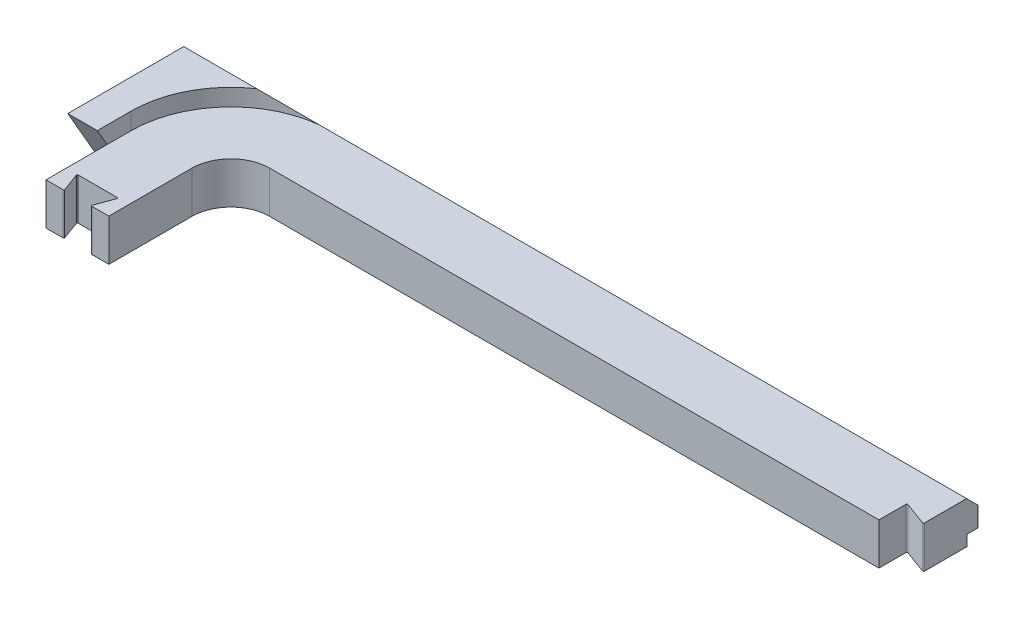
ISO-10303-21;
HEADER;
FILE_DESCRIPTION(('STEP AP214'),'2;1');
FILE_NAME('part.step','',(''),(''),'','','');
FILE_SCHEMA(('AUTOMOTIVE_DESIGN { 1 0 10303 214 1 1 1 1 }'));
ENDSEC;
DATA;
#1=APPLICATION_CONTEXT('core data for automotive mechanical design processes');
#2=APPLICATION_PROTOCOL_DEFINITION('international standard','automotive_design',2000,#1);
#3=PRODUCT_CONTEXT('',#1,'mechanical');
#4=PRODUCT('Part','Part','',(#3));
#5=PRODUCT_RELATED_PRODUCT_CATEGORY('part','',(#4));
#6=PRODUCT_DEFINITION_FORMATION('','',#4);
#7=PRODUCT_DEFINITION_CONTEXT('part definition',#1,'design');
#8=PRODUCT_DEFINITION('design','',#6,#7);
#9=PRODUCT_DEFINITION_SHAPE('','',#8);
#10=(LENGTH_UNIT() NAMED_UNIT(*) SI_UNIT(.MILLI.,.METRE.));
#11=(NAMED_UNIT(*) PLANE_ANGLE_UNIT() SI_UNIT($,.RADIAN.));
#12=(NAMED_UNIT(*) SI_UNIT($,.STERADIAN.) SOLID_ANGLE_UNIT());
#13=UNCERTAINTY_MEASURE_WITH_UNIT(LENGTH_MEASURE(1.E-05),#10,'distance_accuracy_value','');
#14=(GEOMETRIC_REPRESENTATION_CONTEXT(3) GLOBAL_UNCERTAINTY_ASSIGNED_CONTEXT((#13)) GLOBAL_UNIT_ASSIGNED_CONTEXT((#10,
#11,#12)) REPRESENTATION_CONTEXT('',''));
#15=CARTESIAN_POINT('',(0.,0.,0.));
#16=DIRECTION('',(0.,0.,1.));
#17=DIRECTION('',(1.,0.,0.));
#18=AXIS2_PLACEMENT_3D('',#15,#16,#17);
#19=CARTESIAN_POINT('',(-192.3375,0.,0.));
#20=DIRECTION('',(-1.,0.,0.));
#21=DIRECTION('',(0.,0.,1.));
#22=AXIS2_PLACEMENT_3D('',#19,#20,#21);
#23=PLANE('',#22);
#24=DIRECTION('',(0.,-0.707106781186551,-0.707106781186544));
#25=VECTOR('',#24,1.);
#26=CARTESIAN_POINT('',(-192.3375,-2.49586231119696,-370.926089279623));
#27=LINE('',#26,#25);
#28=CARTESIAN_POINT('',(-192.3375,10.2419838828646,-358.188243085561));
#29=VERTEX_POINT('',#28);
#30=CARTESIAN_POINT('',(-192.3375,2.9,-365.530226968426));
#31=VERTEX_POINT('',#30);
#32=EDGE_CURVE('E342',#29,#31,#27,.T.);
#33=ORIENTED_EDGE('',*,*,#32,.F.);
#34=DIRECTION('',(0.,1.,0.));
#35=VECTOR('',#34,1.);
#36=CARTESIAN_POINT('',(-192.3375,0.,-358.188243085561));
#37=LINE('',#36,#35);
#38=CARTESIAN_POINT('',(-192.3375,2.9,-358.188243085561));
#39=VERTEX_POINT('',#38);
#40=EDGE_CURVE('E477',#29,#39,#37,.F.);
#41=ORIENTED_EDGE('',*,*,#40,.T.);
#42=DIRECTION('',(0.,0.,1.));
#43=VECTOR('',#42,1.);
#44=CARTESIAN_POINT('',(-192.3375,2.9,0.));
#45=LINE('',#44,#43);
#46=EDGE_CURVE('E338',#31,#39,#45,.T.);
#47=ORIENTED_EDGE('',*,*,#46,.F.);
#48=EDGE_LOOP('',(#33,#41,#47));
#49=FACE_BOUND('',#48,.T.);
#50=ADVANCED_FACE('F47',(#49),#23,.F.);
#51=CARTESIAN_POINT('',(0.,0.,-307.275));
#52=DIRECTION('',(0.,0.,-1.));
#53=DIRECTION('',(-1.,0.,0.));
#54=AXIS2_PLACEMENT_3D('',#51,#52,#53);
#55=PLANE('',#54);
#56=DIRECTION('',(-1.,0.,0.));
#57=VECTOR('',#56,1.);
#58=CARTESIAN_POINT('',(-357.675,0.,-307.275));
#59=LINE('',#58,#57);
#60=CARTESIAN_POINT('',(-380.060629601348,0.,-307.275));
#61=VERTEX_POINT('',#60);
#62=CARTESIAN_POINT('',(-384.675,0.,-307.275));
#63=VERTEX_POINT('',#62);
#64=EDGE_CURVE('E333',#61,#63,#59,.T.);
#65=ORIENTED_EDGE('',*,*,#64,.F.);
#66=DIRECTION('',(0.,1.,0.));
#67=VECTOR('',#66,1.);
#68=CARTESIAN_POINT('',(-380.060629601348,0.,-307.275));
#69=LINE('',#68,#67);
#70=CARTESIAN_POINT('',(-380.060629601348,11.31,-307.275));
#71=VERTEX_POINT('',#70);
#72=EDGE_CURVE('E536',#61,#71,#69,.T.);
#73=ORIENTED_EDGE('',*,*,#72,.T.);
#74=DIRECTION('',(-1.,0.,0.));
#75=VECTOR('',#74,1.);
#76=CARTESIAN_POINT('',(-357.675,11.31,-307.275));
#77=LINE('',#76,#75);
#78=CARTESIAN_POINT('',(-384.675,11.31,-307.275));
#79=VERTEX_POINT('',#78);
#80=EDGE_CURVE('E468',#71,#79,#77,.T.);
#81=ORIENTED_EDGE('',*,*,#80,.T.);
#82=DIRECTION('',(0.,1.,0.));
#83=VECTOR('',#82,1.);
#84=CARTESIAN_POINT('',(-384.675,2.9,-307.275));
#85=LINE('',#84,#83);
#86=EDGE_CURVE('E334',#63,#79,#85,.T.);
#87=ORIENTED_EDGE('',*,*,#86,.F.);
#88=EDGE_LOOP('',(#65,#73,#81,#87));
#89=FACE_BOUND('',#88,.T.);
#90=ADVANCED_FACE('F583',(#89),#55,.F.);
#91=CARTESIAN_POINT('',(-367.675,11.31,-307.275));
#92=VERTEX_POINT('',#91);
#93=CARTESIAN_POINT('',(-372.289370398652,11.31,-307.275));
#94=VERTEX_POINT('',#93);
#95=EDGE_CURVE('E464',#92,#94,#77,.T.);
#96=ORIENTED_EDGE('',*,*,#95,.T.);
#97=DIRECTION('',(0.,1.,0.));
#98=VECTOR('',#97,1.);
#99=CARTESIAN_POINT('',(-372.289370398652,0.,-307.275));
#100=LINE('',#99,#98);
#101=CARTESIAN_POINT('',(-372.289370398652,0.,-307.275));
#102=VERTEX_POINT('',#101);
#103=EDGE_CURVE('E526',#94,#102,#100,.F.);
#104=ORIENTED_EDGE('',*,*,#103,.T.);
#105=CARTESIAN_POINT('',(-367.675,0.,-307.275));
#106=VERTEX_POINT('',#105);
#107=EDGE_CURVE('E328',#106,#102,#59,.T.);
#108=ORIENTED_EDGE('',*,*,#107,.F.);
#109=DIRECTION('',(0.,1.,0.));
#110=VECTOR('',#109,1.);
#111=CARTESIAN_POINT('',(-367.675,2.9,-307.275));
#112=LINE('',#111,#110);
#113=EDGE_CURVE('E339',#106,#92,#112,.T.);
#114=ORIENTED_EDGE('',*,*,#113,.T.);
#115=EDGE_LOOP('',(#96,#104,#108,#114));
#116=FACE_BOUND('',#115,.T.);
#117=ADVANCED_FACE('F691',(#116),#55,.F.);
#118=DIRECTION('',(0.,0.,1.));
#119=VECTOR('',#118,1.);
#120=CARTESIAN_POINT('',(-192.3375,0.,-330.275));
#121=LINE('',#120,#119);
#122=CARTESIAN_POINT('',(-192.3375,0.,-347.616983882865));
#123=VERTEX_POINT('',#122);
#124=CARTESIAN_POINT('',(-192.3375,0.,-340.275));
#125=VERTEX_POINT('',#124);
#126=EDGE_CURVE('E332',#123,#125,#121,.T.);
#127=ORIENTED_EDGE('',*,*,#126,.F.);
#128=DIRECTION('',(0.,1.,0.));
#129=VECTOR('',#128,1.);
#130=CARTESIAN_POINT('',(-192.3375,0.,-347.616983882865));
#131=LINE('',#130,#129);
#132=CARTESIAN_POINT('',(-192.3375,11.31,-347.616983882865));
#133=VERTEX_POINT('',#132);
#134=EDGE_CURVE('E515',#123,#133,#131,.T.);
#135=ORIENTED_EDGE('',*,*,#134,.T.);
#136=DIRECTION('',(0.,0.,1.));
#137=VECTOR('',#136,1.);
#138=CARTESIAN_POINT('',(-192.3375,11.31,-330.275));
#139=LINE('',#138,#137);
#140=CARTESIAN_POINT('',(-192.3375,11.31,-340.275));
#141=VERTEX_POINT('',#140);
#142=EDGE_CURVE('E318',#133,#141,#139,.T.);
#143=ORIENTED_EDGE('',*,*,#142,.T.);
#144=DIRECTION('',(0.,-1.,0.));
#145=VECTOR('',#144,1.);
#146=CARTESIAN_POINT('',(-192.3375,2.9,-340.275));
#147=LINE('',#146,#145);
#148=EDGE_CURVE('E460',#141,#125,#147,.T.);
#149=ORIENTED_EDGE('',*,*,#148,.T.);
#150=EDGE_LOOP('',(#127,#135,#143,#149));
#151=FACE_BOUND('',#150,.T.);
#152=ADVANCED_FACE('F659',(#151),#23,.F.);
#153=CARTESIAN_POINT('',(-384.675,15.9,-321.157113764813));
#154=DIRECTION('',(0.,0.500000000000001,-0.866025403784438));
#155=DIRECTION('',(0.,0.866025403784438,0.500000000000001));
#156=AXIS2_PLACEMENT_3D('',#153,#154,#155);
#157=PLANE('',#156);
#158=DIRECTION('',(0.,-0.866025403784438,-0.500000000000001));
#159=VECTOR('',#158,1.);
#160=CARTESIAN_POINT('',(-392.675,15.9,-321.157113764813));
#161=LINE('',#160,#159);
#162=CARTESIAN_POINT('',(-392.675,15.9,-321.157113764813));
#163=VERTEX_POINT('',#162);
#164=CARTESIAN_POINT('',(-392.675,2.9,-328.662667264279));
#165=VERTEX_POINT('',#164);
#166=EDGE_CURVE('E401',#163,#165,#161,.T.);
#167=ORIENTED_EDGE('',*,*,#166,.T.);
#168=DIRECTION('',(-1.,0.,0.));
#169=VECTOR('',#168,1.);
#170=CARTESIAN_POINT('',(-384.675,2.9,-328.662667264279));
#171=LINE('',#170,#169);
#172=CARTESIAN_POINT('',(-384.675,2.9,-328.662667264279));
#173=VERTEX_POINT('',#172);
#174=EDGE_CURVE('E393',#173,#165,#171,.T.);
#175=ORIENTED_EDGE('',*,*,#174,.F.);
#176=DIRECTION('',(0.,-0.866025403784438,-0.500000000000001));
#177=VECTOR('',#176,1.);
#178=CARTESIAN_POINT('',(-384.675,15.9,-321.157113764813));
#179=LINE('',#178,#177);
#180=CARTESIAN_POINT('',(-384.675,11.31,-323.807151500394));
#181=VERTEX_POINT('',#180);
#182=EDGE_CURVE('E406',#181,#173,#179,.T.);
#183=ORIENTED_EDGE('',*,*,#182,.F.);
#184=CARTESIAN_POINT('',(-384.675,15.9,-321.157113764813));
#185=VERTEX_POINT('',#184);
#186=EDGE_CURVE('E397',#185,#181,#179,.T.);
#187=ORIENTED_EDGE('',*,*,#186,.F.);
#188=DIRECTION('',(-1.,0.,0.));
#189=VECTOR('',#188,1.);
#190=CARTESIAN_POINT('',(-384.675,15.9,-321.157113764813));
#191=LINE('',#190,#189);
#192=EDGE_CURVE('E390',#185,#163,#191,.T.);
#193=ORIENTED_EDGE('',*,*,#192,.T.);
#194=EDGE_LOOP('',(#167,#175,#183,#187,#193));
#195=FACE_BOUND('',#194,.T.);
#196=ADVANCED_FACE('F608',(#195),#157,.F.);
#197=CARTESIAN_POINT('',(-357.675,2.9,-330.275));
#198=DIRECTION('',(0.,-1.,0.));
#199=DIRECTION('',(0.,0.,-1.));
#200=AXIS2_PLACEMENT_3D('',#197,#198,#199);
#201=CYLINDRICAL_SURFACE('',#200,27.);
#202=CARTESIAN_POINT('',(-357.675,0.,-330.275));
#203=DIRECTION('',(0.,1.,0.));
#204=DIRECTION('',(0.,0.,1.));
#205=AXIS2_PLACEMENT_3D('',#202,#203,#204);
#206=CIRCLE('',#205,27.);
#207=CARTESIAN_POINT('',(-357.675,0.,-357.275));
#208=VERTEX_POINT('',#207);
#209=CARTESIAN_POINT('',(-384.675,0.,-330.275));
#210=VERTEX_POINT('',#209);
#211=EDGE_CURVE('E372',#208,#210,#206,.T.);
#212=ORIENTED_EDGE('',*,*,#211,.T.);
#213=DIRECTION('',(0.,-1.,0.));
#214=VECTOR('',#213,1.);
#215=CARTESIAN_POINT('',(-384.675,2.9,-330.275));
#216=LINE('',#215,#214);
#217=CARTESIAN_POINT('',(-384.675,2.9,-330.275));
#218=VERTEX_POINT('',#217);
#219=EDGE_CURVE('E364',#218,#210,#216,.T.);
#220=ORIENTED_EDGE('',*,*,#219,.F.);
#221=CARTESIAN_POINT('',(-357.675,2.9,-330.275));
#222=DIRECTION('',(0.,1.,0.));
#223=DIRECTION('',(0.,0.,1.));
#224=AXIS2_PLACEMENT_3D('',#221,#222,#223);
#225=CIRCLE('',#224,27.);
#226=CARTESIAN_POINT('',(-357.675,2.9,-357.275));
#227=VERTEX_POINT('',#226);
#228=EDGE_CURVE('E262',#227,#218,#225,.T.);
#229=ORIENTED_EDGE('',*,*,#228,.F.);
#230=DIRECTION('',(0.,-1.,0.));
#231=VECTOR('',#230,1.);
#232=CARTESIAN_POINT('',(-357.675,2.9,-357.275));
#233=LINE('',#232,#231);
#234=EDGE_CURVE('E256',#227,#208,#233,.T.);
#235=ORIENTED_EDGE('',*,*,#234,.T.);
#236=EDGE_LOOP('',(#212,#220,#229,#235));
#237=FACE_BOUND('',#236,.T.);
#238=ADVANCED_FACE('F617',(#237),#201,.T.);
#239=CARTESIAN_POINT('',(-357.675,0.,-330.275));
#240=DIRECTION('',(0.,1.,0.));
#241=DIRECTION('',(0.,0.,1.));
#242=AXIS2_PLACEMENT_3D('',#239,#240,#241);
#243=PLANE('',#242);
#244=DIRECTION('',(0.,0.,1.));
#245=VECTOR('',#244,1.);
#246=CARTESIAN_POINT('',(-185.468806451363,0.,-345.402613484213));
#247=LINE('',#246,#245);
#248=CARTESIAN_POINT('',(-185.468806451363,0.,-357.275));
#249=VERTEX_POINT('',#248);
#250=CARTESIAN_POINT('',(-185.468806451363,0.,-345.688243085561));
#251=VERTEX_POINT('',#250);
#252=EDGE_CURVE('E278',#249,#251,#247,.T.);
#253=ORIENTED_EDGE('',*,*,#252,.T.);
#254=CARTESIAN_POINT('',(-185.668806451363,0.,-345.688243085561));
#255=DIRECTION('',(0.,1.,0.));
#256=DIRECTION('',(0.,0.,1.));
#257=AXIS2_PLACEMENT_3D('',#254,#255,#256);
#258=CIRCLE('',#257,0.2);
#259=CARTESIAN_POINT('',(-185.737210480028,0.,-345.500304561404));
#260=VERTEX_POINT('',#259);
#261=EDGE_CURVE('E512',#251,#260,#258,.F.);
#262=ORIENTED_EDGE('',*,*,#261,.T.);
#263=DIRECTION('',(-0.93969262078591,0.,-0.342020143325665));
#264=VECTOR('',#263,1.);
#265=CARTESIAN_POINT('',(-192.3375,0.,-347.902613484213));
#266=LINE('',#265,#264);
#267=CARTESIAN_POINT('',(-192.069095971335,0.,-347.804922407022));
#268=VERTEX_POINT('',#267);
#269=EDGE_CURVE('E295',#260,#268,#266,.T.);
#270=ORIENTED_EDGE('',*,*,#269,.T.);
#271=CARTESIAN_POINT('',(-192.1375,0.,-347.616983882865));
#272=DIRECTION('',(0.,1.,0.));
#273=DIRECTION('',(0.,0.,1.));
#274=AXIS2_PLACEMENT_3D('',#271,#272,#273);
#275=CIRCLE('',#274,0.2);
#276=EDGE_CURVE('E555',#268,#123,#275,.T.);
#277=ORIENTED_EDGE('',*,*,#276,.T.);
#278=ORIENTED_EDGE('',*,*,#126,.T.);
#279=DIRECTION('',(-1.,0.,0.));
#280=VECTOR('',#279,1.);
#281=CARTESIAN_POINT('',(-367.675,0.,-340.275));
#282=LINE('',#281,#280);
#283=CARTESIAN_POINT('',(-357.175,0.,-340.275));
#284=VERTEX_POINT('',#283);
#285=EDGE_CURVE('E386',#125,#284,#282,.T.);
#286=ORIENTED_EDGE('',*,*,#285,.T.);
#287=CARTESIAN_POINT('',(-357.175,0.,-329.775));
#288=DIRECTION('',(0.,1.,0.));
#289=DIRECTION('',(0.,0.,1.));
#290=AXIS2_PLACEMENT_3D('',#287,#288,#289);
#291=CIRCLE('',#290,10.5);
#292=CARTESIAN_POINT('',(-367.675,0.,-329.775));
#293=VERTEX_POINT('',#292);
#294=EDGE_CURVE('E351',#284,#293,#291,.T.);
#295=ORIENTED_EDGE('',*,*,#294,.T.);
#296=DIRECTION('',(0.,0.,1.));
#297=VECTOR('',#296,1.);
#298=CARTESIAN_POINT('',(-367.675,0.,-17.));
#299=LINE('',#298,#297);
#300=EDGE_CURVE('E381',#293,#106,#299,.T.);
#301=ORIENTED_EDGE('',*,*,#300,.T.);
#302=ORIENTED_EDGE('',*,*,#107,.T.);
#303=CARTESIAN_POINT('',(-372.289370398652,0.,-307.475));
#304=DIRECTION('',(0.,1.,0.));
#305=DIRECTION('',(0.,0.,1.));
#306=AXIS2_PLACEMENT_3D('',#303,#304,#305);
#307=CIRCLE('',#306,0.2);
#308=CARTESIAN_POINT('',(-372.477308922809,0.,-307.543404028665));
#309=VERTEX_POINT('',#308);
#310=EDGE_CURVE('E509',#102,#309,#307,.F.);
#311=ORIENTED_EDGE('',*,*,#310,.T.);
#312=DIRECTION('',(0.342020143325664,0.,-0.93969262078591));
#313=VECTOR('',#312,1.);
#314=CARTESIAN_POINT('',(-370.575,0.,-312.769954838909));
#315=LINE('',#314,#313);
#316=CARTESIAN_POINT('',(-370.672691077191,0.,-312.501550810244));
#317=VERTEX_POINT('',#316);
#318=EDGE_CURVE('E306',#309,#317,#315,.T.);
#319=ORIENTED_EDGE('',*,*,#318,.T.);
#320=CARTESIAN_POINT('',(-370.860629601348,0.,-312.569954838909));
#321=DIRECTION('',(0.,1.,0.));
#322=DIRECTION('',(0.,0.,1.));
#323=AXIS2_PLACEMENT_3D('',#320,#321,#322);
#324=CIRCLE('',#323,0.2);
#325=CARTESIAN_POINT('',(-370.860629601348,0.,-312.769954838909));
#326=VERTEX_POINT('',#325);
#327=EDGE_CURVE('E561',#317,#326,#324,.T.);
#328=ORIENTED_EDGE('',*,*,#327,.T.);
#329=DIRECTION('',(-1.,0.,0.));
#330=VECTOR('',#329,1.);
#331=CARTESIAN_POINT('',(-381.775,0.,-312.769954838909));
#332=LINE('',#331,#330);
#333=CARTESIAN_POINT('',(-381.489370398652,0.,-312.769954838909));
#334=VERTEX_POINT('',#333);
#335=EDGE_CURVE('E310',#326,#334,#332,.T.);
#336=ORIENTED_EDGE('',*,*,#335,.T.);
#337=CARTESIAN_POINT('',(-381.489370398652,0.,-312.569954838909));
#338=DIRECTION('',(0.,1.,0.));
#339=DIRECTION('',(0.,0.,1.));
#340=AXIS2_PLACEMENT_3D('',#337,#338,#339);
#341=CIRCLE('',#340,0.2);
#342=CARTESIAN_POINT('',(-381.677308922809,0.,-312.501550810244));
#343=VERTEX_POINT('',#342);
#344=EDGE_CURVE('E11',#334,#343,#341,.T.);
#345=ORIENTED_EDGE('',*,*,#344,.T.);
#346=DIRECTION('',(0.342020143325667,0.,0.939692620785909));
#347=VECTOR('',#346,1.);
#348=CARTESIAN_POINT('',(-379.775,0.,-307.275));
#349=LINE('',#348,#347);
#350=CARTESIAN_POINT('',(-379.872691077191,0.,-307.543404028665));
#351=VERTEX_POINT('',#350);
#352=EDGE_CURVE('E315',#343,#351,#349,.T.);
#353=ORIENTED_EDGE('',*,*,#352,.T.);
#354=CARTESIAN_POINT('',(-380.060629601348,0.,-307.475));
#355=DIRECTION('',(0.,1.,0.));
#356=DIRECTION('',(0.,0.,1.));
#357=AXIS2_PLACEMENT_3D('',#354,#355,#356);
#358=CIRCLE('',#357,0.2);
#359=EDGE_CURVE('E63',#351,#61,#358,.F.);
#360=ORIENTED_EDGE('',*,*,#359,.T.);
#361=ORIENTED_EDGE('',*,*,#64,.T.);
#362=DIRECTION('',(0.,0.,1.));
#363=VECTOR('',#362,1.);
#364=CARTESIAN_POINT('',(-384.675,0.,0.));
#365=LINE('',#364,#363);
#366=EDGE_CURVE('E261',#210,#63,#365,.T.);
#367=ORIENTED_EDGE('',*,*,#366,.F.);
#368=ORIENTED_EDGE('',*,*,#211,.F.);
#369=DIRECTION('',(-1.,0.,0.));
#370=VECTOR('',#369,1.);
#371=CARTESIAN_POINT('',(-357.675,0.,-357.275));
#372=LINE('',#371,#370);
#373=EDGE_CURVE('E375',#249,#208,#372,.T.);
#374=ORIENTED_EDGE('',*,*,#373,.F.);
#375=EDGE_LOOP('',(#253,#262,#270,#277,#278,#286,#295,#301,#302,#311,#319,#328,#336,#345,#353,
#360,#361,#367,#368,#374));
#376=FACE_BOUND('',#375,.T.);
#377=ADVANCED_FACE('F576',(#376),#243,.F.);
#378=CARTESIAN_POINT('',(-384.675,2.9,0.));
#379=DIRECTION('',(1.,0.,0.));
#380=DIRECTION('',(0.,0.,-1.));
#381=AXIS2_PLACEMENT_3D('',#378,#379,#380);
#382=PLANE('',#381);
#383=ORIENTED_EDGE('',*,*,#366,.T.);
#384=ORIENTED_EDGE('',*,*,#86,.T.);
#385=DIRECTION('',(0.,0.,-1.));
#386=VECTOR('',#385,1.);
#387=CARTESIAN_POINT('',(-384.675,11.31,0.));
#388=LINE('',#387,#386);
#389=EDGE_CURVE('E423',#79,#181,#388,.T.);
#390=ORIENTED_EDGE('',*,*,#389,.T.);
#391=ORIENTED_EDGE('',*,*,#182,.T.);
#392=DIRECTION('',(0.,0.,1.));
#393=VECTOR('',#392,1.);
#394=CARTESIAN_POINT('',(-384.675,2.9,0.));
#395=LINE('',#394,#393);
#396=EDGE_CURVE('E368',#218,#173,#395,.T.);
#397=ORIENTED_EDGE('',*,*,#396,.F.);
#398=ORIENTED_EDGE('',*,*,#219,.T.);
#399=EDGE_LOOP('',(#383,#384,#390,#391,#397,#398));
#400=FACE_BOUND('',#399,.T.);
#401=ADVANCED_FACE('F613',(#400),#382,.F.);
#402=CARTESIAN_POINT('',(-384.675,15.900012,0.));
#403=DIRECTION('',(-1.,0.,0.));
#404=DIRECTION('',(0.,0.,1.));
#405=AXIS2_PLACEMENT_3D('',#402,#403,#404);
#406=PLANE('',#405);
#407=DIRECTION('',(0.,0.,1.));
#408=VECTOR('',#407,1.);
#409=CARTESIAN_POINT('',(-384.675,15.9,0.));
#410=LINE('',#409,#408);
#411=CARTESIAN_POINT('',(-384.675,15.9,-330.275));
#412=VERTEX_POINT('',#411);
#413=EDGE_CURVE('E405',#412,#185,#410,.T.);
#414=ORIENTED_EDGE('',*,*,#413,.T.);
#415=ORIENTED_EDGE('',*,*,#186,.T.);
#416=CARTESIAN_POINT('',(-384.675,11.31,-330.275));
#417=VERTEX_POINT('',#416);
#418=EDGE_CURVE('E428',#181,#417,#388,.T.);
#419=ORIENTED_EDGE('',*,*,#418,.T.);
#420=DIRECTION('',(0.,1.,0.));
#421=VECTOR('',#420,1.);
#422=CARTESIAN_POINT('',(-384.675,11.31,-330.275));
#423=LINE('',#422,#421);
#424=EDGE_CURVE('E419',#417,#412,#423,.T.);
#425=ORIENTED_EDGE('',*,*,#424,.T.);
#426=EDGE_LOOP('',(#414,#415,#419,#425));
#427=FACE_BOUND('',#426,.T.);
#428=ADVANCED_FACE('F594',(#427),#406,.F.);
#429=CARTESIAN_POINT('',(-367.675,2.9,-340.275));
#430=DIRECTION('',(0.,0.,1.));
#431=DIRECTION('',(1.,0.,0.));
#432=AXIS2_PLACEMENT_3D('',#429,#430,#431);
#433=PLANE('',#432);
#434=ORIENTED_EDGE('',*,*,#148,.F.);
#435=DIRECTION('',(-1.,0.,0.));
#436=VECTOR('',#435,1.);
#437=CARTESIAN_POINT('',(-367.675,11.31,-340.275));
#438=LINE('',#437,#436);
#439=CARTESIAN_POINT('',(-357.175,11.31,-340.275));
#440=VERTEX_POINT('',#439);
#441=EDGE_CURVE('E414',#141,#440,#438,.T.);
#442=ORIENTED_EDGE('',*,*,#441,.T.);
#443=DIRECTION('',(0.,-1.,0.));
#444=VECTOR('',#443,1.);
#445=CARTESIAN_POINT('',(-357.175,0.,-340.275));
#446=LINE('',#445,#444);
#447=EDGE_CURVE('E354',#440,#284,#446,.T.);
#448=ORIENTED_EDGE('',*,*,#447,.T.);
#449=ORIENTED_EDGE('',*,*,#285,.F.);
#450=EDGE_LOOP('',(#434,#442,#448,#449));
#451=FACE_BOUND('',#450,.T.);
#452=ADVANCED_FACE('F665',(#451),#433,.T.);
#453=CARTESIAN_POINT('',(-357.175,2.9,-329.775));
#454=DIRECTION('',(0.,1.,0.));
#455=DIRECTION('',(0.,0.,1.));
#456=AXIS2_PLACEMENT_3D('',#453,#454,#455);
#457=CYLINDRICAL_SURFACE('',#456,10.5);
#458=CARTESIAN_POINT('',(-357.175,11.31,-329.775));
#459=DIRECTION('',(0.,1.,0.));
#460=DIRECTION('',(0.,0.,1.));
#461=AXIS2_PLACEMENT_3D('',#458,#459,#460);
#462=CIRCLE('',#461,10.5);
#463=CARTESIAN_POINT('',(-367.675,11.31,-329.775));
#464=VERTEX_POINT('',#463);
#465=EDGE_CURVE('E415',#464,#440,#462,.F.);
#466=ORIENTED_EDGE('',*,*,#465,.F.);
#467=DIRECTION('',(0.,-1.,0.));
#468=VECTOR('',#467,1.);
#469=CARTESIAN_POINT('',(-367.675,2.9,-329.775));
#470=LINE('',#469,#468);
#471=EDGE_CURVE('E358',#293,#464,#470,.F.);
#472=ORIENTED_EDGE('',*,*,#471,.F.);
#473=ORIENTED_EDGE('',*,*,#294,.F.);
#474=ORIENTED_EDGE('',*,*,#447,.F.);
#475=EDGE_LOOP('',(#466,#472,#473,#474));
#476=FACE_BOUND('',#475,.T.);
#477=ADVANCED_FACE('F674',(#476),#457,.F.);
#478=CARTESIAN_POINT('',(-367.675,2.9,-17.));
#479=DIRECTION('',(1.,0.,0.));
#480=DIRECTION('',(0.,0.,-1.));
#481=AXIS2_PLACEMENT_3D('',#478,#479,#480);
#482=PLANE('',#481);
#483=ORIENTED_EDGE('',*,*,#113,.F.);
#484=ORIENTED_EDGE('',*,*,#300,.F.);
#485=ORIENTED_EDGE('',*,*,#471,.T.);
#486=DIRECTION('',(0.,0.,1.));
#487=VECTOR('',#486,1.);
#488=CARTESIAN_POINT('',(-367.675,11.31,-17.));
#489=LINE('',#488,#487);
#490=EDGE_CURVE('E410',#464,#92,#489,.T.);
#491=ORIENTED_EDGE('',*,*,#490,.T.);
#492=EDGE_LOOP('',(#483,#484,#485,#491));
#493=FACE_BOUND('',#492,.T.);
#494=ADVANCED_FACE('F673',(#493),#482,.T.);
#495=CARTESIAN_POINT('',(-357.675,11.31,-330.275));
#496=DIRECTION('',(0.,1.,0.));
#497=DIRECTION('',(0.,0.,1.));
#498=AXIS2_PLACEMENT_3D('',#495,#496,#497);
#499=CYLINDRICAL_SURFACE('',#498,27.);
#500=CARTESIAN_POINT('',(-357.675,11.31,-330.275));
#501=DIRECTION('',(0.,1.,0.));
#502=DIRECTION('',(0.,0.,1.));
#503=AXIS2_PLACEMENT_3D('',#500,#501,#502);
#504=CIRCLE('',#503,27.);
#505=CARTESIAN_POINT('',(-360.561830271022,11.31,-357.120226968426));
#506=VERTEX_POINT('',#505);
#507=EDGE_CURVE('E424',#506,#417,#504,.T.);
#508=ORIENTED_EDGE('',*,*,#507,.F.);
#509=CARTESIAN_POINT('',(-357.675,38.1552269684264,-330.275));
#510=DIRECTION('',(0.,-0.707106781186544,0.707106781186551));
#511=DIRECTION('',(0.,0.707106781186551,0.707106781186544));
#512=AXIS2_PLACEMENT_3D('',#509,#510,#511);
#513=ELLIPSE('',#512,38.1837661840738,27.);
#514=CARTESIAN_POINT('',(-372.962408955864,15.9,-352.530226968426));
#515=VERTEX_POINT('',#514);
#516=EDGE_CURVE('E432',#506,#515,#513,.F.);
#517=ORIENTED_EDGE('',*,*,#516,.T.);
#518=CARTESIAN_POINT('',(-357.675,15.9,-330.275));
#519=DIRECTION('',(0.,1.,0.));
#520=DIRECTION('',(0.,0.,1.));
#521=AXIS2_PLACEMENT_3D('',#518,#519,#520);
#522=CIRCLE('',#521,27.);
#523=EDGE_CURVE('E348',#515,#412,#522,.T.);
#524=ORIENTED_EDGE('',*,*,#523,.T.);
#525=ORIENTED_EDGE('',*,*,#424,.F.);
#526=EDGE_LOOP('',(#508,#517,#524,#525));
#527=FACE_BOUND('',#526,.T.);
#528=ADVANCED_FACE('F600',(#527),#499,.F.);
#529=CARTESIAN_POINT('',(0.,15.9,0.));
#530=DIRECTION('',(0.,1.,0.));
#531=DIRECTION('',(0.,0.,1.));
#532=AXIS2_PLACEMENT_3D('',#529,#530,#531);
#533=PLANE('',#532);
#534=DIRECTION('',(1.,0.,0.));
#535=VECTOR('',#534,1.);
#536=CARTESIAN_POINT('',(-392.675,15.9,-352.530226968426));
#537=LINE('',#536,#535);
#538=CARTESIAN_POINT('',(-392.675,15.9,-352.530226968426));
#539=VERTEX_POINT('',#538);
#540=EDGE_CURVE('E440',#539,#515,#537,.T.);
#541=ORIENTED_EDGE('',*,*,#540,.F.);
#542=DIRECTION('',(0.,0.,1.));
#543=VECTOR('',#542,1.);
#544=CARTESIAN_POINT('',(-392.675,15.9,0.));
#545=LINE('',#544,#543);
#546=EDGE_CURVE('E385',#539,#163,#545,.T.);
#547=ORIENTED_EDGE('',*,*,#546,.T.);
#548=ORIENTED_EDGE('',*,*,#192,.F.);
#549=ORIENTED_EDGE('',*,*,#413,.F.);
#550=ORIENTED_EDGE('',*,*,#523,.F.);
#551=EDGE_LOOP('',(#541,#547,#548,#549,#550));
#552=FACE_BOUND('',#551,.T.);
#553=ADVANCED_FACE('F604',(#552),#533,.T.);
#554=CARTESIAN_POINT('',(-392.675,15.9,0.));
#555=DIRECTION('',(1.,0.,0.));
#556=DIRECTION('',(0.,0.,-1.));
#557=AXIS2_PLACEMENT_3D('',#554,#555,#556);
#558=PLANE('',#557);
#559=ORIENTED_EDGE('',*,*,#546,.F.);
#560=DIRECTION('',(0.,-0.707106781186551,-0.707106781186544));
#561=VECTOR('',#560,1.);
#562=CARTESIAN_POINT('',(-392.675,-2.49586231119696,-370.926089279623));
#563=LINE('',#562,#561);
#564=CARTESIAN_POINT('',(-392.675,2.90000000000003,-365.530226968426));
#565=VERTEX_POINT('',#564);
#566=EDGE_CURVE('E443',#539,#565,#563,.T.);
#567=ORIENTED_EDGE('',*,*,#566,.T.);
#568=DIRECTION('',(0.,0.,1.));
#569=VECTOR('',#568,1.);
#570=CARTESIAN_POINT('',(-392.675,2.9,0.));
#571=LINE('',#570,#569);
#572=EDGE_CURVE('E387',#565,#165,#571,.T.);
#573=ORIENTED_EDGE('',*,*,#572,.T.);
#574=ORIENTED_EDGE('',*,*,#166,.F.);
#575=EDGE_LOOP('',(#559,#567,#573,#574));
#576=FACE_BOUND('',#575,.T.);
#577=ADVANCED_FACE('F621',(#576),#558,.F.);
#578=CARTESIAN_POINT('',(0.,2.9,0.));
#579=DIRECTION('',(0.,1.,0.));
#580=DIRECTION('',(0.,0.,1.));
#581=AXIS2_PLACEMENT_3D('',#578,#579,#580);
#582=PLANE('',#581);
#583=DIRECTION('',(0.939692620785909,0.,-0.342020143325666));
#584=VECTOR('',#583,1.);
#585=CARTESIAN_POINT('',(-185.468806451363,2.9,-360.402613484213));
#586=LINE('',#585,#584);
#587=CARTESIAN_POINT('',(-192.069095971335,2.9,-358.000304561404));
#588=VERTEX_POINT('',#587);
#589=CARTESIAN_POINT('',(-185.737210480028,2.9,-360.304922407022));
#590=VERTEX_POINT('',#589);
#591=EDGE_CURVE('E289',#588,#590,#586,.T.);
#592=ORIENTED_EDGE('',*,*,#591,.T.);
#593=CARTESIAN_POINT('',(-185.668806451363,2.9,-360.116983882865));
#594=DIRECTION('',(0.,1.,0.));
#595=DIRECTION('',(0.,0.,1.));
#596=AXIS2_PLACEMENT_3D('',#593,#594,#595);
#597=CIRCLE('',#596,0.2);
#598=CARTESIAN_POINT('',(-185.468806451363,2.9,-360.116983882865));
#599=VERTEX_POINT('',#598);
#600=EDGE_CURVE('E269',#590,#599,#597,.F.);
#601=ORIENTED_EDGE('',*,*,#600,.T.);
#602=DIRECTION('',(0.,0.,-1.));
#603=VECTOR('',#602,1.);
#604=CARTESIAN_POINT('',(-185.468806451363,2.9,-357.275));
#605=LINE('',#604,#603);
#606=CARTESIAN_POINT('',(-185.468806451363,2.9,-357.275));
#607=VERTEX_POINT('',#606);
#608=EDGE_CURVE('E265',#607,#599,#605,.T.);
#609=ORIENTED_EDGE('',*,*,#608,.F.);
#610=DIRECTION('',(-1.,0.,0.));
#611=VECTOR('',#610,1.);
#612=CARTESIAN_POINT('',(-357.675,2.9,-357.275));
#613=LINE('',#612,#611);
#614=EDGE_CURVE('E249',#607,#227,#613,.T.);
#615=ORIENTED_EDGE('',*,*,#614,.T.);
#616=ORIENTED_EDGE('',*,*,#228,.T.);
#617=ORIENTED_EDGE('',*,*,#396,.T.);
#618=ORIENTED_EDGE('',*,*,#174,.T.);
#619=ORIENTED_EDGE('',*,*,#572,.F.);
#620=DIRECTION('',(1.,0.,0.));
#621=VECTOR('',#620,1.);
#622=CARTESIAN_POINT('',(0.,2.9,-365.530226968426));
#623=LINE('',#622,#621);
#624=EDGE_CURVE('E427',#565,#31,#623,.T.);
#625=ORIENTED_EDGE('',*,*,#624,.T.);
#626=ORIENTED_EDGE('',*,*,#46,.T.);
#627=CARTESIAN_POINT('',(-192.1375,2.9,-358.188243085561));
#628=DIRECTION('',(0.,1.,0.));
#629=DIRECTION('',(0.,0.,1.));
#630=AXIS2_PLACEMENT_3D('',#627,#628,#629);
#631=CIRCLE('',#630,0.2);
#632=EDGE_CURVE('E549',#39,#588,#631,.T.);
#633=ORIENTED_EDGE('',*,*,#632,.T.);
#634=EDGE_LOOP('',(#592,#601,#609,#615,#616,#617,#618,#619,#625,#626,#633));
#635=FACE_BOUND('',#634,.T.);
#636=ADVANCED_FACE('F267',(#635),#582,.F.);
#637=CARTESIAN_POINT('',(-357.675,11.31,-330.275));
#638=DIRECTION('',(0.,1.,0.));
#639=DIRECTION('',(0.,0.,1.));
#640=AXIS2_PLACEMENT_3D('',#637,#638,#639);
#641=PLANE('',#640);
#642=DIRECTION('',(0.93969262078591,0.,0.342020143325665));
#643=VECTOR('',#642,1.);
#644=CARTESIAN_POINT('',(-192.3375,11.31,-347.902613484213));
#645=LINE('',#644,#643);
#646=CARTESIAN_POINT('',(-192.069095971335,11.31,-347.804922407022));
#647=VERTEX_POINT('',#646);
#648=CARTESIAN_POINT('',(-185.737210480028,11.31,-345.500304561404));
#649=VERTEX_POINT('',#648);
#650=EDGE_CURVE('E292',#647,#649,#645,.T.);
#651=ORIENTED_EDGE('',*,*,#650,.T.);
#652=CARTESIAN_POINT('',(-185.668806451363,11.31,-345.688243085561));
#653=DIRECTION('',(0.,1.,0.));
#654=DIRECTION('',(0.,0.,1.));
#655=AXIS2_PLACEMENT_3D('',#652,#653,#654);
#656=CIRCLE('',#655,0.2);
#657=CARTESIAN_POINT('',(-185.468806451363,11.31,-345.688243085561));
#658=VERTEX_POINT('',#657);
#659=EDGE_CURVE('E504',#649,#658,#656,.T.);
#660=ORIENTED_EDGE('',*,*,#659,.T.);
#661=DIRECTION('',(0.,0.,-1.));
#662=VECTOR('',#661,1.);
#663=CARTESIAN_POINT('',(-185.468806451363,11.31,-345.402613484213));
#664=LINE('',#663,#662);
#665=CARTESIAN_POINT('',(-185.468806451363,11.31,-357.120226968426));
#666=VERTEX_POINT('',#665);
#667=EDGE_CURVE('E296',#658,#666,#664,.T.);
#668=ORIENTED_EDGE('',*,*,#667,.T.);
#669=DIRECTION('',(1.,0.,0.));
#670=VECTOR('',#669,1.);
#671=CARTESIAN_POINT('',(-357.675,11.31,-357.120226968426));
#672=LINE('',#671,#670);
#673=EDGE_CURVE('E436',#506,#666,#672,.T.);
#674=ORIENTED_EDGE('',*,*,#673,.F.);
#675=ORIENTED_EDGE('',*,*,#507,.T.);
#676=ORIENTED_EDGE('',*,*,#418,.F.);
#677=ORIENTED_EDGE('',*,*,#389,.F.);
#678=ORIENTED_EDGE('',*,*,#80,.F.);
#679=CARTESIAN_POINT('',(-380.060629601348,11.31,-307.475));
#680=DIRECTION('',(0.,1.,0.));
#681=DIRECTION('',(0.,0.,1.));
#682=AXIS2_PLACEMENT_3D('',#679,#680,#681);
#683=CIRCLE('',#682,0.2);
#684=CARTESIAN_POINT('',(-379.872691077191,11.31,-307.543404028665));
#685=VERTEX_POINT('',#684);
#686=EDGE_CURVE('E498',#71,#685,#683,.T.);
#687=ORIENTED_EDGE('',*,*,#686,.T.);
#688=DIRECTION('',(0.342020143325667,0.,0.939692620785909));
#689=VECTOR('',#688,1.);
#690=CARTESIAN_POINT('',(-379.775,11.31,-307.275));
#691=LINE('',#690,#689);
#692=CARTESIAN_POINT('',(-381.677308922809,11.31,-312.501550810244));
#693=VERTEX_POINT('',#692);
#694=EDGE_CURVE('E311',#693,#685,#691,.T.);
#695=ORIENTED_EDGE('',*,*,#694,.F.);
#696=CARTESIAN_POINT('',(-381.489370398652,11.31,-312.569954838909));
#697=DIRECTION('',(0.,1.,0.));
#698=DIRECTION('',(0.,0.,1.));
#699=AXIS2_PLACEMENT_3D('',#696,#697,#698);
#700=CIRCLE('',#699,0.2);
#701=CARTESIAN_POINT('',(-381.489370398652,11.31,-312.769954838909));
#702=VERTEX_POINT('',#701);
#703=EDGE_CURVE('E56',#693,#702,#700,.F.);
#704=ORIENTED_EDGE('',*,*,#703,.T.);
#705=DIRECTION('',(-1.,0.,0.));
#706=VECTOR('',#705,1.);
#707=CARTESIAN_POINT('',(-381.775,11.31,-312.769954838909));
#708=LINE('',#707,#706);
#709=CARTESIAN_POINT('',(-370.860629601348,11.31,-312.769954838909));
#710=VERTEX_POINT('',#709);
#711=EDGE_CURVE('E322',#710,#702,#708,.T.);
#712=ORIENTED_EDGE('',*,*,#711,.F.);
#713=CARTESIAN_POINT('',(-370.860629601348,11.31,-312.569954838909));
#714=DIRECTION('',(0.,1.,0.));
#715=DIRECTION('',(0.,0.,1.));
#716=AXIS2_PLACEMENT_3D('',#713,#714,#715);
#717=CIRCLE('',#716,0.2);
#718=CARTESIAN_POINT('',(-370.672691077191,11.31,-312.501550810244));
#719=VERTEX_POINT('',#718);
#720=EDGE_CURVE('E558',#710,#719,#717,.F.);
#721=ORIENTED_EDGE('',*,*,#720,.T.);
#722=DIRECTION('',(0.342020143325664,0.,-0.93969262078591));
#723=VECTOR('',#722,1.);
#724=CARTESIAN_POINT('',(-370.575,11.31,-312.769954838909));
#725=LINE('',#724,#723);
#726=CARTESIAN_POINT('',(-372.477308922809,11.31,-307.543404028665));
#727=VERTEX_POINT('',#726);
#728=EDGE_CURVE('E305',#727,#719,#725,.T.);
#729=ORIENTED_EDGE('',*,*,#728,.F.);
#730=CARTESIAN_POINT('',(-372.289370398652,11.31,-307.475));
#731=DIRECTION('',(0.,1.,0.));
#732=DIRECTION('',(0.,0.,1.));
#733=AXIS2_PLACEMENT_3D('',#730,#731,#732);
#734=CIRCLE('',#733,0.2);
#735=EDGE_CURVE('E501',#727,#94,#734,.T.);
#736=ORIENTED_EDGE('',*,*,#735,.T.);
#737=ORIENTED_EDGE('',*,*,#95,.F.);
#738=ORIENTED_EDGE('',*,*,#490,.F.);
#739=ORIENTED_EDGE('',*,*,#465,.T.);
#740=ORIENTED_EDGE('',*,*,#441,.F.);
#741=ORIENTED_EDGE('',*,*,#142,.F.);
#742=CARTESIAN_POINT('',(-192.1375,11.31,-347.616983882865));
#743=DIRECTION('',(0.,1.,0.));
#744=DIRECTION('',(0.,0.,1.));
#745=AXIS2_PLACEMENT_3D('',#742,#743,#744);
#746=CIRCLE('',#745,0.2);
#747=EDGE_CURVE('E552',#133,#647,#746,.F.);
#748=ORIENTED_EDGE('',*,*,#747,.T.);
#749=EDGE_LOOP('',(#651,#660,#668,#674,#675,#676,#677,#678,#687,#695,#704,#712,#721,#729,#736,
#737,#738,#739,#740,#741,#748));
#750=FACE_BOUND('',#749,.T.);
#751=ADVANCED_FACE('F567',(#750),#641,.T.);
#752=CARTESIAN_POINT('',(-392.675,-2.49586231119696,-370.926089279623));
#753=DIRECTION('',(0.,-0.707106781186544,0.707106781186551));
#754=DIRECTION('',(0.,-0.707106781186551,-0.707106781186544));
#755=AXIS2_PLACEMENT_3D('',#752,#753,#754);
#756=PLANE('',#755);
#757=DIRECTION('',(0.,0.707106781186554,0.707106781186541));
#758=VECTOR('',#757,1.);
#759=CARTESIAN_POINT('',(-185.468806451363,11.31,-357.120226968426));
#760=LINE('',#759,#758);
#761=CARTESIAN_POINT('',(-185.468806451363,8.31324308556148,-360.116983882865));
#762=VERTEX_POINT('',#761);
#763=EDGE_CURVE('E280',#762,#666,#760,.T.);
#764=ORIENTED_EDGE('',*,*,#763,.F.);
#765=CARTESIAN_POINT('',(-185.668806451363,8.31324308556146,-360.116983882865));
#766=DIRECTION('',(0.,-0.707106781186544,0.707106781186551));
#767=DIRECTION('',(0.,0.707106781186551,0.707106781186544));
#768=AXIS2_PLACEMENT_3D('',#765,#766,#767);
#769=ELLIPSE('',#768,0.282842712474621,0.2);
#770=CARTESIAN_POINT('',(-185.737210480028,8.12530456140429,-360.304922407022));
#771=VERTEX_POINT('',#770);
#772=EDGE_CURVE('E486',#762,#771,#769,.F.);
#773=ORIENTED_EDGE('',*,*,#772,.T.);
#774=DIRECTION('',(-0.889126490715988,0.323615577118188,0.323615577118182));
#775=VECTOR('',#774,1.);
#776=CARTESIAN_POINT('',(-178.411968644758,5.45913457456417,-362.971092393862));
#777=LINE('',#776,#775);
#778=CARTESIAN_POINT('',(-192.069095971335,10.4299224070219,-358.000304561404));
#779=VERTEX_POINT('',#778);
#780=EDGE_CURVE('E274',#771,#779,#777,.T.);
#781=ORIENTED_EDGE('',*,*,#780,.T.);
#782=CARTESIAN_POINT('',(-192.1375,10.2419838828646,-358.188243085561));
#783=DIRECTION('',(0.,-0.707106781186544,0.707106781186551));
#784=DIRECTION('',(0.,0.707106781186551,0.707106781186544));
#785=AXIS2_PLACEMENT_3D('',#782,#783,#784);
#786=ELLIPSE('',#785,0.282842712474621,0.2);
#787=EDGE_CURVE('E546',#779,#29,#786,.T.);
#788=ORIENTED_EDGE('',*,*,#787,.T.);
#789=ORIENTED_EDGE('',*,*,#32,.T.);
#790=ORIENTED_EDGE('',*,*,#624,.F.);
#791=ORIENTED_EDGE('',*,*,#566,.F.);
#792=ORIENTED_EDGE('',*,*,#540,.T.);
#793=ORIENTED_EDGE('',*,*,#516,.F.);
#794=ORIENTED_EDGE('',*,*,#673,.T.);
#795=EDGE_LOOP('',(#764,#773,#781,#788,#789,#790,#791,#792,#793,#794));
#796=FACE_BOUND('',#795,.T.);
#797=ADVANCED_FACE('F624',(#796),#756,.F.);
#798=CARTESIAN_POINT('',(-357.675,2.9,-357.275));
#799=DIRECTION('',(0.,0.,1.));
#800=DIRECTION('',(1.,0.,0.));
#801=AXIS2_PLACEMENT_3D('',#798,#799,#800);
#802=PLANE('',#801);
#803=ORIENTED_EDGE('',*,*,#614,.F.);
#804=DIRECTION('',(0.,1.,0.));
#805=VECTOR('',#804,1.);
#806=CARTESIAN_POINT('',(-185.468806451363,2.9,-357.275));
#807=LINE('',#806,#805);
#808=EDGE_CURVE('E253',#249,#607,#807,.T.);
#809=ORIENTED_EDGE('',*,*,#808,.F.);
#810=ORIENTED_EDGE('',*,*,#373,.T.);
#811=ORIENTED_EDGE('',*,*,#234,.F.);
#812=EDGE_LOOP('',(#803,#809,#810,#811));
#813=FACE_BOUND('',#812,.T.);
#814=ADVANCED_FACE('F251',(#813),#802,.F.);
#815=CARTESIAN_POINT('',(-379.775,0.,-307.275));
#816=DIRECTION('',(-0.939692620785909,0.,0.342020143325667));
#817=DIRECTION('',(0.342020143325667,0.,0.939692620785909));
#818=AXIS2_PLACEMENT_3D('',#815,#816,#817);
#819=PLANE('',#818);
#820=ORIENTED_EDGE('',*,*,#694,.T.);
#821=DIRECTION('',(0.,1.,0.));
#822=VECTOR('',#821,1.);
#823=CARTESIAN_POINT('',(-379.872691077191,0.,-307.543404028665));
#824=LINE('',#823,#822);
#825=EDGE_CURVE('E71',#685,#351,#824,.F.);
#826=ORIENTED_EDGE('',*,*,#825,.T.);
#827=ORIENTED_EDGE('',*,*,#352,.F.);
#828=DIRECTION('',(0.,1.,0.));
#829=VECTOR('',#828,1.);
#830=CARTESIAN_POINT('',(-381.677308922809,11.31,-312.501550810244));
#831=LINE('',#830,#829);
#832=EDGE_CURVE('E540',#343,#693,#831,.T.);
#833=ORIENTED_EDGE('',*,*,#832,.T.);
#834=EDGE_LOOP('',(#820,#826,#827,#833));
#835=FACE_BOUND('',#834,.T.);
#836=ADVANCED_FACE('F577',(#835),#819,.F.);
#837=CARTESIAN_POINT('',(-381.775,0.,-312.769954838909));
#838=DIRECTION('',(0.,0.,-1.));
#839=DIRECTION('',(-1.,0.,0.));
#840=AXIS2_PLACEMENT_3D('',#837,#838,#839);
#841=PLANE('',#840);
#842=ORIENTED_EDGE('',*,*,#335,.F.);
#843=DIRECTION('',(0.,1.,0.));
#844=VECTOR('',#843,1.);
#845=CARTESIAN_POINT('',(-370.860629601348,11.31,-312.769954838909));
#846=LINE('',#845,#844);
#847=EDGE_CURVE('E532',#326,#710,#846,.T.);
#848=ORIENTED_EDGE('',*,*,#847,.T.);
#849=ORIENTED_EDGE('',*,*,#711,.T.);
#850=DIRECTION('',(0.,1.,0.));
#851=VECTOR('',#850,1.);
#852=CARTESIAN_POINT('',(-381.489370398652,0.,-312.769954838909));
#853=LINE('',#852,#851);
#854=EDGE_CURVE('E529',#702,#334,#853,.F.);
#855=ORIENTED_EDGE('',*,*,#854,.T.);
#856=EDGE_LOOP('',(#842,#848,#849,#855));
#857=FACE_BOUND('',#856,.T.);
#858=ADVANCED_FACE('F573',(#857),#841,.F.);
#859=CARTESIAN_POINT('',(-370.575,0.,-312.769954838909));
#860=DIRECTION('',(0.93969262078591,0.,0.342020143325664));
#861=DIRECTION('',(0.342020143325664,0.,-0.93969262078591));
#862=AXIS2_PLACEMENT_3D('',#859,#860,#861);
#863=PLANE('',#862);
#864=ORIENTED_EDGE('',*,*,#318,.F.);
#865=DIRECTION('',(0.,1.,0.));
#866=VECTOR('',#865,1.);
#867=CARTESIAN_POINT('',(-372.477308922809,0.,-307.543404028665));
#868=LINE('',#867,#866);
#869=EDGE_CURVE('E522',#309,#727,#868,.T.);
#870=ORIENTED_EDGE('',*,*,#869,.T.);
#871=ORIENTED_EDGE('',*,*,#728,.T.);
#872=DIRECTION('',(0.,1.,0.));
#873=VECTOR('',#872,1.);
#874=CARTESIAN_POINT('',(-370.672691077191,0.,-312.501550810244));
#875=LINE('',#874,#873);
#876=EDGE_CURVE('E519',#719,#317,#875,.F.);
#877=ORIENTED_EDGE('',*,*,#876,.T.);
#878=EDGE_LOOP('',(#864,#870,#871,#877));
#879=FACE_BOUND('',#878,.T.);
#880=ADVANCED_FACE('F753',(#879),#863,.F.);
#881=CARTESIAN_POINT('',(-185.468806451363,-16.4978468614872,-360.402613484213));
#882=DIRECTION('',(-0.342020143325666,0.,-0.939692620785909));
#883=DIRECTION('',(-0.939692620785909,0.,0.342020143325666));
#884=AXIS2_PLACEMENT_3D('',#881,#882,#883);
#885=PLANE('',#884);
#886=ORIENTED_EDGE('',*,*,#591,.F.);
#887=DIRECTION('',(0.,1.,0.));
#888=VECTOR('',#887,1.);
#889=CARTESIAN_POINT('',(-192.069095971335,-16.4978468614872,-358.000304561404));
#890=LINE('',#889,#888);
#891=EDGE_CURVE('E473',#588,#779,#890,.T.);
#892=ORIENTED_EDGE('',*,*,#891,.T.);
#893=ORIENTED_EDGE('',*,*,#780,.F.);
#894=DIRECTION('',(0.,1.,0.));
#895=VECTOR('',#894,1.);
#896=CARTESIAN_POINT('',(-185.737210480028,-16.4978468614872,-360.304922407022));
#897=LINE('',#896,#895);
#898=EDGE_CURVE('E446',#771,#590,#897,.F.);
#899=ORIENTED_EDGE('',*,*,#898,.T.);
#900=EDGE_LOOP('',(#886,#892,#893,#899));
#901=FACE_BOUND('',#900,.T.);
#902=ADVANCED_FACE('F636',(#901),#885,.T.);
#903=CARTESIAN_POINT('',(-185.468806451363,-16.4978468614872,-345.402613484213));
#904=DIRECTION('',(1.,0.,0.));
#905=DIRECTION('',(0.,0.,-1.));
#906=AXIS2_PLACEMENT_3D('',#903,#904,#905);
#907=PLANE('',#906);
#908=ORIENTED_EDGE('',*,*,#608,.T.);
#909=DIRECTION('',(0.,1.,0.));
#910=VECTOR('',#909,1.);
#911=CARTESIAN_POINT('',(-185.468806451363,-16.4978468614872,-360.116983882865));
#912=LINE('',#911,#910);
#913=EDGE_CURVE('E483',#599,#762,#912,.T.);
#914=ORIENTED_EDGE('',*,*,#913,.T.);
#915=ORIENTED_EDGE('',*,*,#763,.T.);
#916=ORIENTED_EDGE('',*,*,#667,.F.);
#917=DIRECTION('',(0.,1.,0.));
#918=VECTOR('',#917,1.);
#919=CARTESIAN_POINT('',(-185.468806451363,-16.4978468614872,-345.688243085561));
#920=LINE('',#919,#918);
#921=EDGE_CURVE('E480',#658,#251,#920,.F.);
#922=ORIENTED_EDGE('',*,*,#921,.T.);
#923=ORIENTED_EDGE('',*,*,#252,.F.);
#924=ORIENTED_EDGE('',*,*,#808,.T.);
#925=EDGE_LOOP('',(#908,#914,#915,#916,#922,#923,#924));
#926=FACE_BOUND('',#925,.T.);
#927=ADVANCED_FACE('F276',(#926),#907,.T.);
#928=CARTESIAN_POINT('',(-192.3375,-16.4978468614872,-347.902613484213));
#929=DIRECTION('',(-0.342020143325665,0.,0.93969262078591));
#930=DIRECTION('',(0.93969262078591,0.,0.342020143325665));
#931=AXIS2_PLACEMENT_3D('',#928,#929,#930);
#932=PLANE('',#931);
#933=ORIENTED_EDGE('',*,*,#269,.F.);
#934=DIRECTION('',(0.,1.,0.));
#935=VECTOR('',#934,1.);
#936=CARTESIAN_POINT('',(-185.737210480028,-16.4978468614872,-345.500304561404));
#937=LINE('',#936,#935);
#938=EDGE_CURVE('E494',#260,#649,#937,.T.);
#939=ORIENTED_EDGE('',*,*,#938,.T.);
#940=ORIENTED_EDGE('',*,*,#650,.F.);
#941=DIRECTION('',(0.,1.,0.));
#942=VECTOR('',#941,1.);
#943=CARTESIAN_POINT('',(-192.069095971335,-16.4978468614872,-347.804922407022));
#944=LINE('',#943,#942);
#945=EDGE_CURVE('E491',#647,#268,#944,.F.);
#946=ORIENTED_EDGE('',*,*,#945,.T.);
#947=EDGE_LOOP('',(#933,#939,#940,#946));
#948=FACE_BOUND('',#947,.T.);
#949=ADVANCED_FACE('F650',(#948),#932,.T.);
#950=CARTESIAN_POINT('',(-192.1375,-16.4978468614872,-358.188243085561));
#951=DIRECTION('',(0.,1.,0.));
#952=DIRECTION('',(0.,0.,1.));
#953=AXIS2_PLACEMENT_3D('',#950,#951,#952);
#954=CYLINDRICAL_SURFACE('',#953,0.2);
#955=ORIENTED_EDGE('',*,*,#632,.F.);
#956=ORIENTED_EDGE('',*,*,#40,.F.);
#957=ORIENTED_EDGE('',*,*,#787,.F.);
#958=ORIENTED_EDGE('',*,*,#891,.F.);
#959=EDGE_LOOP('',(#955,#956,#957,#958));
#960=FACE_BOUND('',#959,.T.);
#961=ADVANCED_FACE('F633',(#960),#954,.F.);
#962=CARTESIAN_POINT('',(-185.668806451363,-16.4978468614872,-360.116983882865));
#963=DIRECTION('',(0.,1.,0.));
#964=DIRECTION('',(0.,0.,1.));
#965=AXIS2_PLACEMENT_3D('',#962,#963,#964);
#966=CYLINDRICAL_SURFACE('',#965,0.2);
#967=ORIENTED_EDGE('',*,*,#600,.F.);
#968=ORIENTED_EDGE('',*,*,#898,.F.);
#969=ORIENTED_EDGE('',*,*,#772,.F.);
#970=ORIENTED_EDGE('',*,*,#913,.F.);
#971=EDGE_LOOP('',(#967,#968,#969,#970));
#972=FACE_BOUND('',#971,.T.);
#973=ADVANCED_FACE('F639',(#972),#966,.T.);
#974=CARTESIAN_POINT('',(-185.668806451363,-16.4978468614872,-345.688243085561));
#975=DIRECTION('',(0.,1.,0.));
#976=DIRECTION('',(0.,0.,1.));
#977=AXIS2_PLACEMENT_3D('',#974,#975,#976);
#978=CYLINDRICAL_SURFACE('',#977,0.2);
#979=ORIENTED_EDGE('',*,*,#261,.F.);
#980=ORIENTED_EDGE('',*,*,#921,.F.);
#981=ORIENTED_EDGE('',*,*,#659,.F.);
#982=ORIENTED_EDGE('',*,*,#938,.F.);
#983=EDGE_LOOP('',(#979,#980,#981,#982));
#984=FACE_BOUND('',#983,.T.);
#985=ADVANCED_FACE('F647',(#984),#978,.T.);
#986=CARTESIAN_POINT('',(-192.1375,0.,-347.616983882865));
#987=DIRECTION('',(0.,1.,0.));
#988=DIRECTION('',(0.,0.,1.));
#989=AXIS2_PLACEMENT_3D('',#986,#987,#988);
#990=CYLINDRICAL_SURFACE('',#989,0.2);
#991=ORIENTED_EDGE('',*,*,#276,.F.);
#992=ORIENTED_EDGE('',*,*,#945,.F.);
#993=ORIENTED_EDGE('',*,*,#747,.F.);
#994=ORIENTED_EDGE('',*,*,#134,.F.);
#995=EDGE_LOOP('',(#991,#992,#993,#994));
#996=FACE_BOUND('',#995,.T.);
#997=ADVANCED_FACE('F656',(#996),#990,.F.);
#998=CARTESIAN_POINT('',(-372.289370398652,0.,-307.475));
#999=DIRECTION('',(0.,1.,0.));
#1000=DIRECTION('',(0.,0.,1.));
#1001=AXIS2_PLACEMENT_3D('',#998,#999,#1000);
#1002=CYLINDRICAL_SURFACE('',#1001,0.2);
#1003=ORIENTED_EDGE('',*,*,#310,.F.);
#1004=ORIENTED_EDGE('',*,*,#103,.F.);
#1005=ORIENTED_EDGE('',*,*,#735,.F.);
#1006=ORIENTED_EDGE('',*,*,#869,.F.);
#1007=EDGE_LOOP('',(#1003,#1004,#1005,#1006));
#1008=FACE_BOUND('',#1007,.T.);
#1009=ADVANCED_FACE('F808',(#1008),#1002,.T.);
#1010=CARTESIAN_POINT('',(-370.860629601348,0.,-312.569954838909));
#1011=DIRECTION('',(0.,-1.,0.));
#1012=DIRECTION('',(0.,0.,-1.));
#1013=AXIS2_PLACEMENT_3D('',#1010,#1011,#1012);
#1014=CYLINDRICAL_SURFACE('',#1013,0.2);
#1015=ORIENTED_EDGE('',*,*,#327,.F.);
#1016=ORIENTED_EDGE('',*,*,#876,.F.);
#1017=ORIENTED_EDGE('',*,*,#720,.F.);
#1018=ORIENTED_EDGE('',*,*,#847,.F.);
#1019=EDGE_LOOP('',(#1015,#1016,#1017,#1018));
#1020=FACE_BOUND('',#1019,.T.);
#1021=ADVANCED_FACE('F816',(#1020),#1014,.F.);
#1022=CARTESIAN_POINT('',(-380.060629601348,0.,-307.475));
#1023=DIRECTION('',(0.,1.,0.));
#1024=DIRECTION('',(0.,0.,1.));
#1025=AXIS2_PLACEMENT_3D('',#1022,#1023,#1024);
#1026=CYLINDRICAL_SURFACE('',#1025,0.2);
#1027=ORIENTED_EDGE('',*,*,#359,.F.);
#1028=ORIENTED_EDGE('',*,*,#825,.F.);
#1029=ORIENTED_EDGE('',*,*,#686,.F.);
#1030=ORIENTED_EDGE('',*,*,#72,.F.);
#1031=EDGE_LOOP('',(#1027,#1028,#1029,#1030));
#1032=FACE_BOUND('',#1031,.T.);
#1033=ADVANCED_FACE('F579',(#1032),#1026,.T.);
#1034=CARTESIAN_POINT('',(-381.489370398652,0.,-312.569954838909));
#1035=DIRECTION('',(0.,-1.,0.));
#1036=DIRECTION('',(0.,0.,-1.));
#1037=AXIS2_PLACEMENT_3D('',#1034,#1035,#1036);
#1038=CYLINDRICAL_SURFACE('',#1037,0.2);
#1039=ORIENTED_EDGE('',*,*,#344,.F.);
#1040=ORIENTED_EDGE('',*,*,#854,.F.);
#1041=ORIENTED_EDGE('',*,*,#703,.F.);
#1042=ORIENTED_EDGE('',*,*,#832,.F.);
#1043=EDGE_LOOP('',(#1039,#1040,#1041,#1042));
#1044=FACE_BOUND('',#1043,.T.);
#1045=ADVANCED_FACE('F49',(#1044),#1038,.F.);
#1046=CLOSED_SHELL('',(#50,#90,#117,#152,#196,#238,#377,#401,#428,#452,#477,#494,#528,#553,#577,
#636,#751,#797,#814,#836,#858,#880,#902,#927,#949,#961,#973,#985,#997,#1009,#1021,#1033,#1045));
#1047=MANIFOLD_SOLID_BREP('B2',#1046);
#1048=ADVANCED_BREP_SHAPE_REPRESENTATION('',(#18,#1047),#14);
#1049=SHAPE_DEFINITION_REPRESENTATION(#9,#1048);
ENDSEC;
END-ISO-10303-21;
